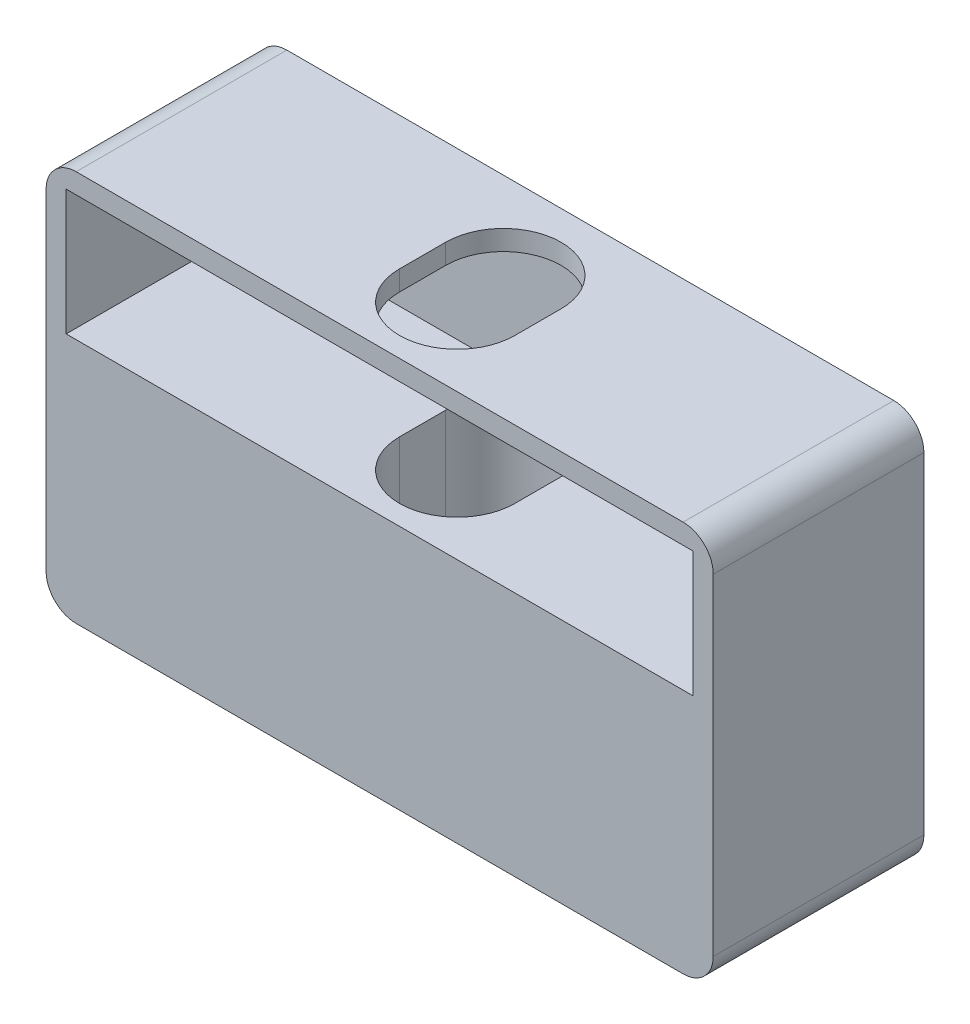
ISO-10303-21;
HEADER;
FILE_DESCRIPTION(('STEP AP214'),'2;1');
FILE_NAME('part.step','',(''),(''),'','','');
FILE_SCHEMA(('AUTOMOTIVE_DESIGN { 1 0 10303 214 1 1 1 1 }'));
ENDSEC;
DATA;
#1=APPLICATION_CONTEXT('core data for automotive mechanical design processes');
#2=APPLICATION_PROTOCOL_DEFINITION('international standard','automotive_design',2000,#1);
#3=PRODUCT_CONTEXT('',#1,'mechanical');
#4=PRODUCT('Part','Part','',(#3));
#5=PRODUCT_RELATED_PRODUCT_CATEGORY('part','',(#4));
#6=PRODUCT_DEFINITION_FORMATION('','',#4);
#7=PRODUCT_DEFINITION_CONTEXT('part definition',#1,'design');
#8=PRODUCT_DEFINITION('design','',#6,#7);
#9=PRODUCT_DEFINITION_SHAPE('','',#8);
#10=(LENGTH_UNIT() NAMED_UNIT(*) SI_UNIT(.MILLI.,.METRE.));
#11=(NAMED_UNIT(*) PLANE_ANGLE_UNIT() SI_UNIT($,.RADIAN.));
#12=(NAMED_UNIT(*) SI_UNIT($,.STERADIAN.) SOLID_ANGLE_UNIT());
#13=UNCERTAINTY_MEASURE_WITH_UNIT(LENGTH_MEASURE(1.E-05),#10,'distance_accuracy_value','');
#14=(GEOMETRIC_REPRESENTATION_CONTEXT(3) GLOBAL_UNCERTAINTY_ASSIGNED_CONTEXT((#13)) GLOBAL_UNIT_ASSIGNED_CONTEXT((#10,
#11,#12)) REPRESENTATION_CONTEXT('',''));
#15=CARTESIAN_POINT('',(0.,0.,0.));
#16=DIRECTION('',(0.,0.,1.));
#17=DIRECTION('',(1.,0.,0.));
#18=AXIS2_PLACEMENT_3D('',#15,#16,#17);
#19=CARTESIAN_POINT('',(0.,0.,0.4));
#20=DIRECTION('',(0.,0.,1.));
#21=DIRECTION('',(1.,0.,0.));
#22=AXIS2_PLACEMENT_3D('',#19,#20,#21);
#23=PLANE('',#22);
#24=DIRECTION('',(0.,1.,0.));
#25=VECTOR('',#24,1.);
#26=CARTESIAN_POINT('',(6.25,1.25,0.4));
#27=LINE('',#26,#25);
#28=CARTESIAN_POINT('',(6.25,-1.25,0.4));
#29=VERTEX_POINT('',#28);
#30=CARTESIAN_POINT('',(6.25,1.25,0.4));
#31=VERTEX_POINT('',#30);
#32=EDGE_CURVE('E306',#29,#31,#27,.T.);
#33=ORIENTED_EDGE('',*,*,#32,.T.);
#34=DIRECTION('',(-1.,0.,0.));
#35=VECTOR('',#34,1.);
#36=CARTESIAN_POINT('',(-6.25,1.25,0.4));
#37=LINE('',#36,#35);
#38=CARTESIAN_POINT('',(-6.25,1.25,0.4));
#39=VERTEX_POINT('',#38);
#40=EDGE_CURVE('E315',#31,#39,#37,.T.);
#41=ORIENTED_EDGE('',*,*,#40,.T.);
#42=DIRECTION('',(0.,-1.,0.));
#43=VECTOR('',#42,1.);
#44=CARTESIAN_POINT('',(-6.25,1.25,0.4));
#45=LINE('',#44,#43);
#46=CARTESIAN_POINT('',(-6.25,-1.25,0.4));
#47=VERTEX_POINT('',#46);
#48=EDGE_CURVE('E318',#39,#47,#45,.T.);
#49=ORIENTED_EDGE('',*,*,#48,.T.);
#50=DIRECTION('',(1.,0.,0.));
#51=VECTOR('',#50,1.);
#52=CARTESIAN_POINT('',(-6.25,-1.25,0.4));
#53=LINE('',#52,#51);
#54=EDGE_CURVE('E321',#47,#29,#53,.T.);
#55=ORIENTED_EDGE('',*,*,#54,.T.);
#56=EDGE_LOOP('',(#33,#41,#49,#55));
#57=FACE_BOUND('',#56,.T.);
#58=ADVANCED_FACE('F59',(#57),#23,.T.);
#59=CARTESIAN_POINT('',(0.,0.,4.2));
#60=DIRECTION('',(0.,0.,1.));
#61=DIRECTION('',(1.,0.,0.));
#62=AXIS2_PLACEMENT_3D('',#59,#60,#61);
#63=PLANE('',#62);
#64=DIRECTION('',(-1.,0.,0.));
#65=VECTOR('',#64,1.);
#66=CARTESIAN_POINT('',(6.65,-6.15,4.2));
#67=LINE('',#66,#65);
#68=CARTESIAN_POINT('',(6.05,-6.15,4.2));
#69=VERTEX_POINT('',#68);
#70=CARTESIAN_POINT('',(-6.05,-6.15,4.2));
#71=VERTEX_POINT('',#70);
#72=EDGE_CURVE('E271',#69,#71,#67,.T.);
#73=ORIENTED_EDGE('',*,*,#72,.F.);
#74=CARTESIAN_POINT('',(6.05,-5.55,4.2));
#75=DIRECTION('',(0.,0.,1.));
#76=DIRECTION('',(1.,0.,0.));
#77=AXIS2_PLACEMENT_3D('',#74,#75,#76);
#78=CIRCLE('',#77,0.6);
#79=CARTESIAN_POINT('',(6.65,-5.55,4.2));
#80=VERTEX_POINT('',#79);
#81=EDGE_CURVE('E336',#69,#80,#78,.T.);
#82=ORIENTED_EDGE('',*,*,#81,.T.);
#83=DIRECTION('',(0.,-1.,0.));
#84=VECTOR('',#83,1.);
#85=CARTESIAN_POINT('',(6.65,1.25,4.2));
#86=LINE('',#85,#84);
#87=CARTESIAN_POINT('',(6.65,1.05,4.2));
#88=VERTEX_POINT('',#87);
#89=EDGE_CURVE('E299',#88,#80,#86,.T.);
#90=ORIENTED_EDGE('',*,*,#89,.F.);
#91=CARTESIAN_POINT('',(6.05,1.05,4.2));
#92=DIRECTION('',(0.,0.,1.));
#93=DIRECTION('',(1.,0.,0.));
#94=AXIS2_PLACEMENT_3D('',#91,#92,#93);
#95=CIRCLE('',#94,0.6);
#96=CARTESIAN_POINT('',(6.05,1.65,4.2));
#97=VERTEX_POINT('',#96);
#98=EDGE_CURVE('E334',#88,#97,#95,.T.);
#99=ORIENTED_EDGE('',*,*,#98,.T.);
#100=DIRECTION('',(1.,0.,0.));
#101=VECTOR('',#100,1.);
#102=CARTESIAN_POINT('',(-6.25,1.65,4.2));
#103=LINE('',#102,#101);
#104=CARTESIAN_POINT('',(-6.05,1.65,4.2));
#105=VERTEX_POINT('',#104);
#106=EDGE_CURVE('E303',#105,#97,#103,.T.);
#107=ORIENTED_EDGE('',*,*,#106,.F.);
#108=CARTESIAN_POINT('',(-6.05,1.05,4.2));
#109=DIRECTION('',(0.,0.,1.));
#110=DIRECTION('',(1.,0.,0.));
#111=AXIS2_PLACEMENT_3D('',#108,#109,#110);
#112=CIRCLE('',#111,0.6);
#113=CARTESIAN_POINT('',(-6.65,1.05,4.2));
#114=VERTEX_POINT('',#113);
#115=EDGE_CURVE('E332',#105,#114,#112,.T.);
#116=ORIENTED_EDGE('',*,*,#115,.T.);
#117=DIRECTION('',(0.,-1.,0.));
#118=VECTOR('',#117,1.);
#119=CARTESIAN_POINT('',(-6.65,1.25,4.2));
#120=LINE('',#119,#118);
#121=CARTESIAN_POINT('',(-6.65,-5.55,4.2));
#122=VERTEX_POINT('',#121);
#123=EDGE_CURVE('E296',#114,#122,#120,.T.);
#124=ORIENTED_EDGE('',*,*,#123,.T.);
#125=CARTESIAN_POINT('',(-6.05,-5.55,4.2));
#126=DIRECTION('',(0.,0.,1.));
#127=DIRECTION('',(1.,0.,0.));
#128=AXIS2_PLACEMENT_3D('',#125,#126,#127);
#129=CIRCLE('',#128,0.6);
#130=EDGE_CURVE('E330',#122,#71,#129,.T.);
#131=ORIENTED_EDGE('',*,*,#130,.T.);
#132=EDGE_LOOP('',(#73,#82,#90,#99,#107,#116,#124,#131));
#133=FACE_BOUND('',#132,.T.);
#134=DIRECTION('',(1.,0.,0.));
#135=VECTOR('',#134,1.);
#136=CARTESIAN_POINT('',(-6.25,-1.25,4.2));
#137=LINE('',#136,#135);
#138=CARTESIAN_POINT('',(-6.25,-1.25,4.2));
#139=VERTEX_POINT('',#138);
#140=CARTESIAN_POINT('',(6.25,-1.25,4.2));
#141=VERTEX_POINT('',#140);
#142=EDGE_CURVE('E276',#139,#141,#137,.T.);
#143=ORIENTED_EDGE('',*,*,#142,.F.);
#144=DIRECTION('',(0.,-1.,0.));
#145=VECTOR('',#144,1.);
#146=CARTESIAN_POINT('',(-6.25,1.25,4.2));
#147=LINE('',#146,#145);
#148=CARTESIAN_POINT('',(-6.25,1.25,4.2));
#149=VERTEX_POINT('',#148);
#150=EDGE_CURVE('E274',#149,#139,#147,.T.);
#151=ORIENTED_EDGE('',*,*,#150,.F.);
#152=DIRECTION('',(1.,0.,0.));
#153=VECTOR('',#152,1.);
#154=CARTESIAN_POINT('',(-6.25,1.25,4.2));
#155=LINE('',#154,#153);
#156=CARTESIAN_POINT('',(6.25,1.25,4.2));
#157=VERTEX_POINT('',#156);
#158=EDGE_CURVE('E281',#149,#157,#155,.T.);
#159=ORIENTED_EDGE('',*,*,#158,.T.);
#160=DIRECTION('',(0.,-1.,0.));
#161=VECTOR('',#160,1.);
#162=CARTESIAN_POINT('',(6.25,1.25,4.2));
#163=LINE('',#162,#161);
#164=EDGE_CURVE('E278',#157,#141,#163,.T.);
#165=ORIENTED_EDGE('',*,*,#164,.T.);
#166=EDGE_LOOP('',(#143,#151,#159,#165));
#167=FACE_BOUND('',#166,.T.);
#168=ADVANCED_FACE('F360',(#133,#167),#63,.T.);
#169=CARTESIAN_POINT('',(-6.65,1.25,4.2));
#170=DIRECTION('',(1.,0.,0.));
#171=DIRECTION('',(0.,0.,-1.));
#172=AXIS2_PLACEMENT_3D('',#169,#170,#171);
#173=PLANE('',#172);
#174=ORIENTED_EDGE('',*,*,#123,.F.);
#175=DIRECTION('',(0.,0.,-1.));
#176=VECTOR('',#175,1.);
#177=CARTESIAN_POINT('',(-6.65,1.05,0.));
#178=LINE('',#177,#176);
#179=CARTESIAN_POINT('',(-6.65,1.05,0.));
#180=VERTEX_POINT('',#179);
#181=EDGE_CURVE('E12',#114,#180,#178,.T.);
#182=ORIENTED_EDGE('',*,*,#181,.T.);
#183=DIRECTION('',(0.,-1.,0.));
#184=VECTOR('',#183,1.);
#185=CARTESIAN_POINT('',(-6.65,1.25,0.));
#186=LINE('',#185,#184);
#187=CARTESIAN_POINT('',(-6.65,-5.55,0.));
#188=VERTEX_POINT('',#187);
#189=EDGE_CURVE('E295',#180,#188,#186,.T.);
#190=ORIENTED_EDGE('',*,*,#189,.T.);
#191=DIRECTION('',(0.,0.,-1.));
#192=VECTOR('',#191,1.);
#193=CARTESIAN_POINT('',(-6.65,-5.55,4.2));
#194=LINE('',#193,#192);
#195=EDGE_CURVE('E67',#188,#122,#194,.F.);
#196=ORIENTED_EDGE('',*,*,#195,.T.);
#197=EDGE_LOOP('',(#174,#182,#190,#196));
#198=FACE_BOUND('',#197,.T.);
#199=ADVANCED_FACE('F354',(#198),#173,.F.);
#200=CARTESIAN_POINT('',(6.65,1.25,4.2));
#201=DIRECTION('',(1.,0.,0.));
#202=DIRECTION('',(0.,0.,-1.));
#203=AXIS2_PLACEMENT_3D('',#200,#201,#202);
#204=PLANE('',#203);
#205=ORIENTED_EDGE('',*,*,#89,.T.);
#206=DIRECTION('',(0.,0.,1.));
#207=VECTOR('',#206,1.);
#208=CARTESIAN_POINT('',(6.65,-5.55,4.2));
#209=LINE('',#208,#207);
#210=CARTESIAN_POINT('',(6.65,-5.55,0.));
#211=VERTEX_POINT('',#210);
#212=EDGE_CURVE('E340',#80,#211,#209,.F.);
#213=ORIENTED_EDGE('',*,*,#212,.T.);
#214=DIRECTION('',(0.,-1.,0.));
#215=VECTOR('',#214,1.);
#216=CARTESIAN_POINT('',(6.65,1.25,0.));
#217=LINE('',#216,#215);
#218=CARTESIAN_POINT('',(6.65,1.05,0.));
#219=VERTEX_POINT('',#218);
#220=EDGE_CURVE('E309',#219,#211,#217,.T.);
#221=ORIENTED_EDGE('',*,*,#220,.F.);
#222=DIRECTION('',(0.,0.,-1.));
#223=VECTOR('',#222,1.);
#224=CARTESIAN_POINT('',(6.65,1.05,4.2));
#225=LINE('',#224,#223);
#226=EDGE_CURVE('E338',#219,#88,#225,.F.);
#227=ORIENTED_EDGE('',*,*,#226,.T.);
#228=EDGE_LOOP('',(#205,#213,#221,#227));
#229=FACE_BOUND('',#228,.T.);
#230=ADVANCED_FACE('F376',(#229),#204,.T.);
#231=CARTESIAN_POINT('',(-6.25,1.65,4.2));
#232=DIRECTION('',(0.,1.,0.));
#233=DIRECTION('',(0.,0.,1.));
#234=AXIS2_PLACEMENT_3D('',#231,#232,#233);
#235=PLANE('',#234);
#236=CARTESIAN_POINT('',(0.,1.65,1.7334994251912));
#237=DIRECTION('',(0.,1.,0.));
#238=DIRECTION('',(0.,0.,1.));
#239=AXIS2_PLACEMENT_3D('',#236,#237,#238);
#240=CIRCLE('',#239,1.15);
#241=CARTESIAN_POINT('',(1.15,1.65,1.7334994251912));
#242=VERTEX_POINT('',#241);
#243=CARTESIAN_POINT('',(-1.15,1.65,1.73349942519121));
#244=VERTEX_POINT('',#243);
#245=EDGE_CURVE('E234',#242,#244,#240,.T.);
#246=ORIENTED_EDGE('',*,*,#245,.F.);
#247=DIRECTION('',(0.,0.,-1.));
#248=VECTOR('',#247,1.);
#249=CARTESIAN_POINT('',(1.15,1.65,1.7334994251912));
#250=LINE('',#249,#248);
#251=CARTESIAN_POINT('',(1.15,1.65,2.65498658471042));
#252=VERTEX_POINT('',#251);
#253=EDGE_CURVE('E226',#252,#242,#250,.T.);
#254=ORIENTED_EDGE('',*,*,#253,.F.);
#255=CARTESIAN_POINT('',(0.,1.65,2.65498658471042));
#256=DIRECTION('',(0.,1.,0.));
#257=DIRECTION('',(0.,0.,1.));
#258=AXIS2_PLACEMENT_3D('',#255,#256,#257);
#259=CIRCLE('',#258,1.15);
#260=CARTESIAN_POINT('',(-1.15,1.65,2.65498658471042));
#261=VERTEX_POINT('',#260);
#262=EDGE_CURVE('E229',#261,#252,#259,.T.);
#263=ORIENTED_EDGE('',*,*,#262,.F.);
#264=DIRECTION('',(0.,0.,1.));
#265=VECTOR('',#264,1.);
#266=CARTESIAN_POINT('',(-1.15,1.65,1.7334994251912));
#267=LINE('',#266,#265);
#268=EDGE_CURVE('E236',#244,#261,#267,.T.);
#269=ORIENTED_EDGE('',*,*,#268,.F.);
#270=EDGE_LOOP('',(#246,#254,#263,#269));
#271=FACE_BOUND('',#270,.T.);
#272=ORIENTED_EDGE('',*,*,#106,.T.);
#273=DIRECTION('',(0.,0.,-1.));
#274=VECTOR('',#273,1.);
#275=CARTESIAN_POINT('',(6.05,1.65,4.2));
#276=LINE('',#275,#274);
#277=CARTESIAN_POINT('',(6.05,1.65,0.));
#278=VERTEX_POINT('',#277);
#279=EDGE_CURVE('E350',#97,#278,#276,.T.);
#280=ORIENTED_EDGE('',*,*,#279,.T.);
#281=DIRECTION('',(1.,0.,0.));
#282=VECTOR('',#281,1.);
#283=CARTESIAN_POINT('',(-6.25,1.65,0.));
#284=LINE('',#283,#282);
#285=CARTESIAN_POINT('',(-6.05,1.65,0.));
#286=VERTEX_POINT('',#285);
#287=EDGE_CURVE('E300',#286,#278,#284,.T.);
#288=ORIENTED_EDGE('',*,*,#287,.F.);
#289=DIRECTION('',(0.,0.,-1.));
#290=VECTOR('',#289,1.);
#291=CARTESIAN_POINT('',(-6.05,1.65,4.2));
#292=LINE('',#291,#290);
#293=EDGE_CURVE('E348',#286,#105,#292,.F.);
#294=ORIENTED_EDGE('',*,*,#293,.T.);
#295=EDGE_LOOP('',(#272,#280,#288,#294));
#296=FACE_BOUND('',#295,.T.);
#297=ADVANCED_FACE('F379',(#271,#296),#235,.T.);
#298=CARTESIAN_POINT('',(-6.25,1.25,4.2));
#299=DIRECTION('',(1.,0.,0.));
#300=DIRECTION('',(0.,0.,-1.));
#301=AXIS2_PLACEMENT_3D('',#298,#299,#300);
#302=PLANE('',#301);
#303=DIRECTION('',(0.,0.,-1.));
#304=VECTOR('',#303,1.);
#305=CARTESIAN_POINT('',(-6.25,-1.25,4.2));
#306=LINE('',#305,#304);
#307=EDGE_CURVE('E292',#139,#47,#306,.T.);
#308=ORIENTED_EDGE('',*,*,#307,.T.);
#309=ORIENTED_EDGE('',*,*,#48,.F.);
#310=DIRECTION('',(0.,0.,-1.));
#311=VECTOR('',#310,1.);
#312=CARTESIAN_POINT('',(-6.25,1.25,4.2));
#313=LINE('',#312,#311);
#314=EDGE_CURVE('E284',#149,#39,#313,.T.);
#315=ORIENTED_EDGE('',*,*,#314,.F.);
#316=ORIENTED_EDGE('',*,*,#150,.T.);
#317=EDGE_LOOP('',(#308,#309,#315,#316));
#318=FACE_BOUND('',#317,.T.);
#319=ADVANCED_FACE('F440',(#318),#302,.T.);
#320=CARTESIAN_POINT('',(-6.25,-1.25,4.2));
#321=DIRECTION('',(0.,1.,0.));
#322=DIRECTION('',(0.,0.,1.));
#323=AXIS2_PLACEMENT_3D('',#320,#321,#322);
#324=PLANE('',#323);
#325=CARTESIAN_POINT('',(0.,-1.25,1.7334994251912));
#326=DIRECTION('',(0.,1.,0.));
#327=DIRECTION('',(0.,0.,1.));
#328=AXIS2_PLACEMENT_3D('',#325,#326,#327);
#329=CIRCLE('',#328,1.15);
#330=CARTESIAN_POINT('',(1.15,-1.25,1.7334994251912));
#331=VERTEX_POINT('',#330);
#332=CARTESIAN_POINT('',(-1.15,-1.25,1.73349942519121));
#333=VERTEX_POINT('',#332);
#334=EDGE_CURVE('E206',#331,#333,#329,.T.);
#335=ORIENTED_EDGE('',*,*,#334,.F.);
#336=DIRECTION('',(0.,0.,-1.));
#337=VECTOR('',#336,1.);
#338=CARTESIAN_POINT('',(1.15,-1.25,4.2));
#339=LINE('',#338,#337);
#340=CARTESIAN_POINT('',(1.15,-1.25,2.65498658471042));
#341=VERTEX_POINT('',#340);
#342=EDGE_CURVE('E262',#341,#331,#339,.T.);
#343=ORIENTED_EDGE('',*,*,#342,.F.);
#344=CARTESIAN_POINT('',(0.,-1.25,2.65498658471042));
#345=DIRECTION('',(0.,1.,0.));
#346=DIRECTION('',(0.,0.,1.));
#347=AXIS2_PLACEMENT_3D('',#344,#345,#346);
#348=CIRCLE('',#347,1.15);
#349=CARTESIAN_POINT('',(-1.15,-1.25,2.65498658471042));
#350=VERTEX_POINT('',#349);
#351=EDGE_CURVE('E257',#350,#341,#348,.T.);
#352=ORIENTED_EDGE('',*,*,#351,.F.);
#353=DIRECTION('',(0.,0.,1.));
#354=VECTOR('',#353,1.);
#355=CARTESIAN_POINT('',(-1.15,-1.25,4.2));
#356=LINE('',#355,#354);
#357=EDGE_CURVE('E252',#333,#350,#356,.T.);
#358=ORIENTED_EDGE('',*,*,#357,.F.);
#359=EDGE_LOOP('',(#335,#343,#352,#358));
#360=FACE_BOUND('',#359,.T.);
#361=DIRECTION('',(0.,0.,-1.));
#362=VECTOR('',#361,1.);
#363=CARTESIAN_POINT('',(6.25,-1.25,4.2));
#364=LINE('',#363,#362);
#365=EDGE_CURVE('E289',#141,#29,#364,.T.);
#366=ORIENTED_EDGE('',*,*,#365,.T.);
#367=ORIENTED_EDGE('',*,*,#54,.F.);
#368=ORIENTED_EDGE('',*,*,#307,.F.);
#369=ORIENTED_EDGE('',*,*,#142,.T.);
#370=EDGE_LOOP('',(#366,#367,#368,#369));
#371=FACE_BOUND('',#370,.T.);
#372=ADVANCED_FACE('F436',(#360,#371),#324,.T.);
#373=CARTESIAN_POINT('',(6.25,1.25,4.2));
#374=DIRECTION('',(1.,0.,0.));
#375=DIRECTION('',(0.,0.,-1.));
#376=AXIS2_PLACEMENT_3D('',#373,#374,#375);
#377=PLANE('',#376);
#378=ORIENTED_EDGE('',*,*,#32,.F.);
#379=ORIENTED_EDGE('',*,*,#365,.F.);
#380=ORIENTED_EDGE('',*,*,#164,.F.);
#381=DIRECTION('',(0.,0.,-1.));
#382=VECTOR('',#381,1.);
#383=CARTESIAN_POINT('',(6.25,1.25,4.2));
#384=LINE('',#383,#382);
#385=EDGE_CURVE('E286',#157,#31,#384,.T.);
#386=ORIENTED_EDGE('',*,*,#385,.T.);
#387=EDGE_LOOP('',(#378,#379,#380,#386));
#388=FACE_BOUND('',#387,.T.);
#389=ADVANCED_FACE('F432',(#388),#377,.F.);
#390=CARTESIAN_POINT('',(-6.25,1.25,4.2));
#391=DIRECTION('',(0.,1.,0.));
#392=DIRECTION('',(0.,0.,1.));
#393=AXIS2_PLACEMENT_3D('',#390,#391,#392);
#394=PLANE('',#393);
#395=DIRECTION('',(0.,0.,-1.));
#396=VECTOR('',#395,1.);
#397=CARTESIAN_POINT('',(1.15,1.25,4.2));
#398=LINE('',#397,#396);
#399=CARTESIAN_POINT('',(1.15,1.25,2.65498658471042));
#400=VERTEX_POINT('',#399);
#401=CARTESIAN_POINT('',(1.15,1.25,1.7334994251912));
#402=VERTEX_POINT('',#401);
#403=EDGE_CURVE('E259',#400,#402,#398,.T.);
#404=ORIENTED_EDGE('',*,*,#403,.T.);
#405=CARTESIAN_POINT('',(0.,1.25,1.7334994251912));
#406=DIRECTION('',(0.,1.,0.));
#407=DIRECTION('',(0.,0.,1.));
#408=AXIS2_PLACEMENT_3D('',#405,#406,#407);
#409=CIRCLE('',#408,1.15);
#410=CARTESIAN_POINT('',(-1.15,1.25,1.7334994251912));
#411=VERTEX_POINT('',#410);
#412=EDGE_CURVE('E264',#402,#411,#409,.T.);
#413=ORIENTED_EDGE('',*,*,#412,.T.);
#414=DIRECTION('',(0.,0.,1.));
#415=VECTOR('',#414,1.);
#416=CARTESIAN_POINT('',(-1.15,1.25,4.2));
#417=LINE('',#416,#415);
#418=CARTESIAN_POINT('',(-1.15,1.25,2.65498658471042));
#419=VERTEX_POINT('',#418);
#420=EDGE_CURVE('E243',#411,#419,#417,.T.);
#421=ORIENTED_EDGE('',*,*,#420,.T.);
#422=CARTESIAN_POINT('',(0.,1.25,2.65498658471042));
#423=DIRECTION('',(0.,1.,0.));
#424=DIRECTION('',(0.,0.,1.));
#425=AXIS2_PLACEMENT_3D('',#422,#423,#424);
#426=CIRCLE('',#425,1.15);
#427=EDGE_CURVE('E254',#419,#400,#426,.T.);
#428=ORIENTED_EDGE('',*,*,#427,.T.);
#429=EDGE_LOOP('',(#404,#413,#421,#428));
#430=FACE_BOUND('',#429,.T.);
#431=ORIENTED_EDGE('',*,*,#40,.F.);
#432=ORIENTED_EDGE('',*,*,#385,.F.);
#433=ORIENTED_EDGE('',*,*,#158,.F.);
#434=ORIENTED_EDGE('',*,*,#314,.T.);
#435=EDGE_LOOP('',(#431,#432,#433,#434));
#436=FACE_BOUND('',#435,.T.);
#437=ADVANCED_FACE('F401',(#430,#436),#394,.F.);
#438=CARTESIAN_POINT('',(0.,0.,0.));
#439=DIRECTION('',(0.,0.,1.));
#440=DIRECTION('',(1.,0.,0.));
#441=AXIS2_PLACEMENT_3D('',#438,#439,#440);
#442=PLANE('',#441);
#443=ORIENTED_EDGE('',*,*,#220,.T.);
#444=CARTESIAN_POINT('',(6.05,-5.55,0.));
#445=DIRECTION('',(0.,0.,1.));
#446=DIRECTION('',(1.,0.,0.));
#447=AXIS2_PLACEMENT_3D('',#444,#445,#446);
#448=CIRCLE('',#447,0.6);
#449=CARTESIAN_POINT('',(6.05,-6.15,0.));
#450=VERTEX_POINT('',#449);
#451=EDGE_CURVE('E346',#211,#450,#448,.F.);
#452=ORIENTED_EDGE('',*,*,#451,.T.);
#453=DIRECTION('',(1.,0.,0.));
#454=VECTOR('',#453,1.);
#455=CARTESIAN_POINT('',(-6.65,-6.15,0.));
#456=LINE('',#455,#454);
#457=CARTESIAN_POINT('',(-6.05,-6.15,0.));
#458=VERTEX_POINT('',#457);
#459=EDGE_CURVE('E268',#458,#450,#456,.T.);
#460=ORIENTED_EDGE('',*,*,#459,.F.);
#461=CARTESIAN_POINT('',(-6.05,-5.55,0.));
#462=DIRECTION('',(0.,0.,1.));
#463=DIRECTION('',(1.,0.,0.));
#464=AXIS2_PLACEMENT_3D('',#461,#462,#463);
#465=CIRCLE('',#464,0.6);
#466=EDGE_CURVE('E342',#458,#188,#465,.F.);
#467=ORIENTED_EDGE('',*,*,#466,.T.);
#468=ORIENTED_EDGE('',*,*,#189,.F.);
#469=CARTESIAN_POINT('',(-6.05,1.05,0.));
#470=DIRECTION('',(0.,0.,1.));
#471=DIRECTION('',(1.,0.,0.));
#472=AXIS2_PLACEMENT_3D('',#469,#470,#471);
#473=CIRCLE('',#472,0.6);
#474=EDGE_CURVE('E82',#180,#286,#473,.F.);
#475=ORIENTED_EDGE('',*,*,#474,.T.);
#476=ORIENTED_EDGE('',*,*,#287,.T.);
#477=CARTESIAN_POINT('',(6.05,1.05,0.));
#478=DIRECTION('',(0.,0.,1.));
#479=DIRECTION('',(1.,0.,0.));
#480=AXIS2_PLACEMENT_3D('',#477,#478,#479);
#481=CIRCLE('',#480,0.6);
#482=EDGE_CURVE('E74',#278,#219,#481,.F.);
#483=ORIENTED_EDGE('',*,*,#482,.T.);
#484=EDGE_LOOP('',(#443,#452,#460,#467,#468,#475,#476,#483));
#485=FACE_BOUND('',#484,.T.);
#486=ADVANCED_FACE('F367',(#485),#442,.F.);
#487=CARTESIAN_POINT('',(0.,-6.15,0.));
#488=DIRECTION('',(0.,-1.,0.));
#489=DIRECTION('',(0.,0.,-1.));
#490=AXIS2_PLACEMENT_3D('',#487,#488,#489);
#491=PLANE('',#490);
#492=CARTESIAN_POINT('',(0.,-6.15,1.7334994251912));
#493=DIRECTION('',(0.,1.,0.));
#494=DIRECTION('',(0.,0.,1.));
#495=AXIS2_PLACEMENT_3D('',#492,#493,#494);
#496=CIRCLE('',#495,1.15);
#497=CARTESIAN_POINT('',(1.15,-6.15,1.7334994251912));
#498=VERTEX_POINT('',#497);
#499=CARTESIAN_POINT('',(-1.15,-6.15,1.7334994251912));
#500=VERTEX_POINT('',#499);
#501=EDGE_CURVE('E203',#498,#500,#496,.T.);
#502=ORIENTED_EDGE('',*,*,#501,.T.);
#503=DIRECTION('',(0.,0.,1.));
#504=VECTOR('',#503,1.);
#505=CARTESIAN_POINT('',(-1.15,-6.15,1.7334994251912));
#506=LINE('',#505,#504);
#507=CARTESIAN_POINT('',(-1.15,-6.15,2.65498658471042));
#508=VERTEX_POINT('',#507);
#509=EDGE_CURVE('E214',#500,#508,#506,.T.);
#510=ORIENTED_EDGE('',*,*,#509,.T.);
#511=CARTESIAN_POINT('',(0.,-6.15,2.65498658471042));
#512=DIRECTION('',(0.,1.,0.));
#513=DIRECTION('',(0.,0.,1.));
#514=AXIS2_PLACEMENT_3D('',#511,#512,#513);
#515=CIRCLE('',#514,1.15);
#516=CARTESIAN_POINT('',(1.15,-6.15,2.65498658471042));
#517=VERTEX_POINT('',#516);
#518=EDGE_CURVE('E220',#508,#517,#515,.T.);
#519=ORIENTED_EDGE('',*,*,#518,.T.);
#520=DIRECTION('',(0.,0.,-1.));
#521=VECTOR('',#520,1.);
#522=CARTESIAN_POINT('',(1.15,-6.15,1.7334994251912));
#523=LINE('',#522,#521);
#524=EDGE_CURVE('E225',#517,#498,#523,.T.);
#525=ORIENTED_EDGE('',*,*,#524,.T.);
#526=EDGE_LOOP('',(#502,#510,#519,#525));
#527=FACE_BOUND('',#526,.T.);
#528=ORIENTED_EDGE('',*,*,#459,.T.);
#529=DIRECTION('',(0.,0.,1.));
#530=VECTOR('',#529,1.);
#531=CARTESIAN_POINT('',(6.05,-6.15,0.));
#532=LINE('',#531,#530);
#533=EDGE_CURVE('E327',#450,#69,#532,.T.);
#534=ORIENTED_EDGE('',*,*,#533,.T.);
#535=ORIENTED_EDGE('',*,*,#72,.T.);
#536=DIRECTION('',(0.,0.,-1.));
#537=VECTOR('',#536,1.);
#538=CARTESIAN_POINT('',(-6.05,-6.15,0.));
#539=LINE('',#538,#537);
#540=EDGE_CURVE('E324',#71,#458,#539,.T.);
#541=ORIENTED_EDGE('',*,*,#540,.T.);
#542=EDGE_LOOP('',(#528,#534,#535,#541));
#543=FACE_BOUND('',#542,.T.);
#544=ADVANCED_FACE('F222',(#527,#543),#491,.T.);
#545=CARTESIAN_POINT('',(-1.15,-6.15,1.7334994251912));
#546=DIRECTION('',(-1.,0.,0.));
#547=DIRECTION('',(0.,0.,1.));
#548=AXIS2_PLACEMENT_3D('',#545,#546,#547);
#549=PLANE('',#548);
#550=ORIENTED_EDGE('',*,*,#357,.T.);
#551=DIRECTION('',(0.,1.,0.));
#552=VECTOR('',#551,1.);
#553=CARTESIAN_POINT('',(-1.15,-6.15,2.65498658471042));
#554=LINE('',#553,#552);
#555=EDGE_CURVE('E217',#508,#350,#554,.T.);
#556=ORIENTED_EDGE('',*,*,#555,.F.);
#557=ORIENTED_EDGE('',*,*,#509,.F.);
#558=DIRECTION('',(0.,1.,0.));
#559=VECTOR('',#558,1.);
#560=CARTESIAN_POINT('',(-1.15,-6.15,1.7334994251912));
#561=LINE('',#560,#559);
#562=EDGE_CURVE('E198',#500,#333,#561,.T.);
#563=ORIENTED_EDGE('',*,*,#562,.T.);
#564=EDGE_LOOP('',(#550,#556,#557,#563));
#565=FACE_BOUND('',#564,.T.);
#566=ADVANCED_FACE('F215',(#565),#549,.F.);
#567=CARTESIAN_POINT('',(0.,-6.15,2.65498658471042));
#568=DIRECTION('',(0.,1.,0.));
#569=DIRECTION('',(0.,0.,1.));
#570=AXIS2_PLACEMENT_3D('',#567,#568,#569);
#571=CYLINDRICAL_SURFACE('',#570,1.15);
#572=ORIENTED_EDGE('',*,*,#351,.T.);
#573=DIRECTION('',(0.,1.,0.));
#574=VECTOR('',#573,1.);
#575=CARTESIAN_POINT('',(1.15,-6.15,2.65498658471042));
#576=LINE('',#575,#574);
#577=EDGE_CURVE('E245',#517,#341,#576,.T.);
#578=ORIENTED_EDGE('',*,*,#577,.F.);
#579=ORIENTED_EDGE('',*,*,#518,.F.);
#580=ORIENTED_EDGE('',*,*,#555,.T.);
#581=EDGE_LOOP('',(#572,#578,#579,#580));
#582=FACE_BOUND('',#581,.T.);
#583=ADVANCED_FACE('F416',(#582),#571,.F.);
#584=CARTESIAN_POINT('',(1.15,-6.15,1.7334994251912));
#585=DIRECTION('',(1.,0.,0.));
#586=DIRECTION('',(0.,0.,-1.));
#587=AXIS2_PLACEMENT_3D('',#584,#585,#586);
#588=PLANE('',#587);
#589=ORIENTED_EDGE('',*,*,#342,.T.);
#590=DIRECTION('',(0.,1.,0.));
#591=VECTOR('',#590,1.);
#592=CARTESIAN_POINT('',(1.15,-6.15,1.7334994251912));
#593=LINE('',#592,#591);
#594=EDGE_CURVE('E241',#498,#331,#593,.T.);
#595=ORIENTED_EDGE('',*,*,#594,.F.);
#596=ORIENTED_EDGE('',*,*,#524,.F.);
#597=ORIENTED_EDGE('',*,*,#577,.T.);
#598=EDGE_LOOP('',(#589,#595,#596,#597));
#599=FACE_BOUND('',#598,.T.);
#600=ADVANCED_FACE('F424',(#599),#588,.F.);
#601=CARTESIAN_POINT('',(0.,-6.15,1.7334994251912));
#602=DIRECTION('',(0.,1.,0.));
#603=DIRECTION('',(0.,0.,1.));
#604=AXIS2_PLACEMENT_3D('',#601,#602,#603);
#605=CYLINDRICAL_SURFACE('',#604,1.15);
#606=ORIENTED_EDGE('',*,*,#334,.T.);
#607=ORIENTED_EDGE('',*,*,#562,.F.);
#608=ORIENTED_EDGE('',*,*,#501,.F.);
#609=ORIENTED_EDGE('',*,*,#594,.T.);
#610=EDGE_LOOP('',(#606,#607,#608,#609));
#611=FACE_BOUND('',#610,.T.);
#612=ADVANCED_FACE('F200',(#611),#605,.F.);
#613=EDGE_CURVE('E244',#402,#242,#593,.T.);
#614=ORIENTED_EDGE('',*,*,#613,.T.);
#615=ORIENTED_EDGE('',*,*,#245,.T.);
#616=EDGE_CURVE('E210',#411,#244,#561,.T.);
#617=ORIENTED_EDGE('',*,*,#616,.F.);
#618=ORIENTED_EDGE('',*,*,#412,.F.);
#619=EDGE_LOOP('',(#614,#615,#617,#618));
#620=FACE_BOUND('',#619,.T.);
#621=ADVANCED_FACE('F479',(#620),#605,.F.);
#622=EDGE_CURVE('E248',#400,#252,#576,.T.);
#623=ORIENTED_EDGE('',*,*,#622,.T.);
#624=ORIENTED_EDGE('',*,*,#253,.T.);
#625=ORIENTED_EDGE('',*,*,#613,.F.);
#626=ORIENTED_EDGE('',*,*,#403,.F.);
#627=EDGE_LOOP('',(#623,#624,#625,#626));
#628=FACE_BOUND('',#627,.T.);
#629=ADVANCED_FACE('F413',(#628),#588,.F.);
#630=EDGE_CURVE('E209',#419,#261,#554,.T.);
#631=ORIENTED_EDGE('',*,*,#630,.T.);
#632=ORIENTED_EDGE('',*,*,#262,.T.);
#633=ORIENTED_EDGE('',*,*,#622,.F.);
#634=ORIENTED_EDGE('',*,*,#427,.F.);
#635=EDGE_LOOP('',(#631,#632,#633,#634));
#636=FACE_BOUND('',#635,.T.);
#637=ADVANCED_FACE('F407',(#636),#571,.F.);
#638=ORIENTED_EDGE('',*,*,#616,.T.);
#639=ORIENTED_EDGE('',*,*,#268,.T.);
#640=ORIENTED_EDGE('',*,*,#630,.F.);
#641=ORIENTED_EDGE('',*,*,#420,.F.);
#642=EDGE_LOOP('',(#638,#639,#640,#641));
#643=FACE_BOUND('',#642,.T.);
#644=ADVANCED_FACE('F403',(#643),#549,.F.);
#645=CARTESIAN_POINT('',(6.05,-5.55,0.));
#646=DIRECTION('',(0.,0.,1.));
#647=DIRECTION('',(1.,0.,0.));
#648=AXIS2_PLACEMENT_3D('',#645,#646,#647);
#649=CYLINDRICAL_SURFACE('',#648,0.6);
#650=ORIENTED_EDGE('',*,*,#451,.F.);
#651=ORIENTED_EDGE('',*,*,#212,.F.);
#652=ORIENTED_EDGE('',*,*,#81,.F.);
#653=ORIENTED_EDGE('',*,*,#533,.F.);
#654=EDGE_LOOP('',(#650,#651,#652,#653));
#655=FACE_BOUND('',#654,.T.);
#656=ADVANCED_FACE('F372',(#655),#649,.T.);
#657=CARTESIAN_POINT('',(6.05,1.05,4.2));
#658=DIRECTION('',(0.,0.,-1.));
#659=DIRECTION('',(-1.,0.,0.));
#660=AXIS2_PLACEMENT_3D('',#657,#658,#659);
#661=CYLINDRICAL_SURFACE('',#660,0.6);
#662=ORIENTED_EDGE('',*,*,#98,.F.);
#663=ORIENTED_EDGE('',*,*,#226,.F.);
#664=ORIENTED_EDGE('',*,*,#482,.F.);
#665=ORIENTED_EDGE('',*,*,#279,.F.);
#666=EDGE_LOOP('',(#662,#663,#664,#665));
#667=FACE_BOUND('',#666,.T.);
#668=ADVANCED_FACE('F377',(#667),#661,.T.);
#669=CARTESIAN_POINT('',(-6.05,1.05,4.2));
#670=DIRECTION('',(0.,0.,1.));
#671=DIRECTION('',(1.,0.,0.));
#672=AXIS2_PLACEMENT_3D('',#669,#670,#671);
#673=CYLINDRICAL_SURFACE('',#672,0.6);
#674=ORIENTED_EDGE('',*,*,#115,.F.);
#675=ORIENTED_EDGE('',*,*,#293,.F.);
#676=ORIENTED_EDGE('',*,*,#474,.F.);
#677=ORIENTED_EDGE('',*,*,#181,.F.);
#678=EDGE_LOOP('',(#674,#675,#676,#677));
#679=FACE_BOUND('',#678,.T.);
#680=ADVANCED_FACE('F382',(#679),#673,.T.);
#681=CARTESIAN_POINT('',(-6.05,-5.55,0.));
#682=DIRECTION('',(0.,0.,1.));
#683=DIRECTION('',(1.,0.,0.));
#684=AXIS2_PLACEMENT_3D('',#681,#682,#683);
#685=CYLINDRICAL_SURFACE('',#684,0.6);
#686=ORIENTED_EDGE('',*,*,#130,.F.);
#687=ORIENTED_EDGE('',*,*,#195,.F.);
#688=ORIENTED_EDGE('',*,*,#466,.F.);
#689=ORIENTED_EDGE('',*,*,#540,.F.);
#690=EDGE_LOOP('',(#686,#687,#688,#689));
#691=FACE_BOUND('',#690,.T.);
#692=ADVANCED_FACE('F61',(#691),#685,.T.);
#693=CLOSED_SHELL('',(#58,#168,#199,#230,#297,#319,#372,#389,#437,#486,#544,#566,#583,#600,#612,
#621,#629,#637,#644,#656,#668,#680,#692));
#694=MANIFOLD_SOLID_BREP('B2',#693);
#695=ADVANCED_BREP_SHAPE_REPRESENTATION('',(#18,#694),#14);
#696=SHAPE_DEFINITION_REPRESENTATION(#9,#695);
ENDSEC;
END-ISO-10303-21;
